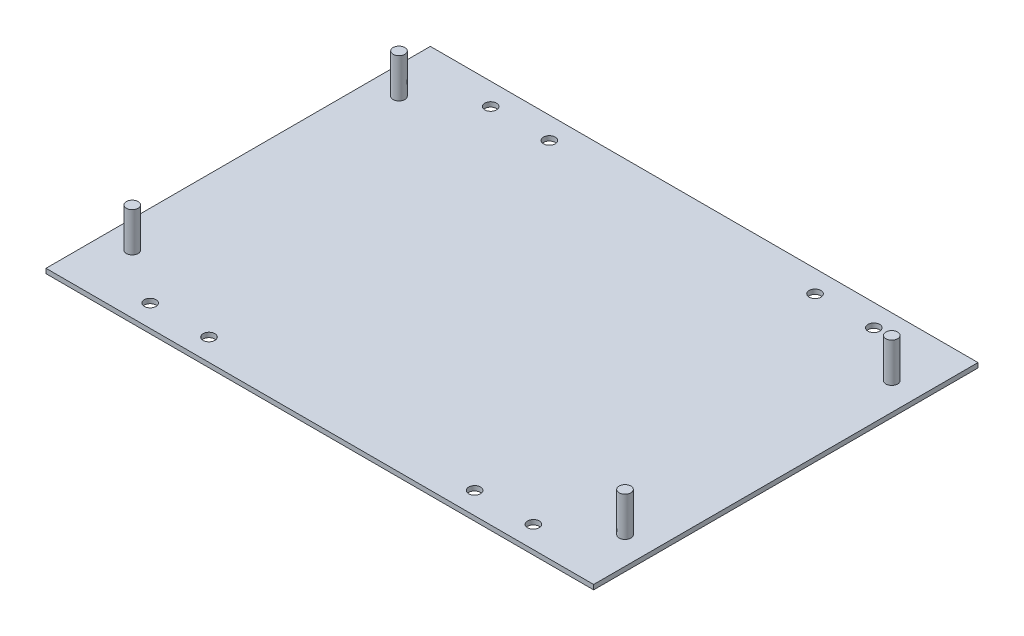
ISO-10303-21;
HEADER;
FILE_DESCRIPTION(('STEP AP214'),'2;1');
FILE_NAME('part.step','',(''),(''),'','','');
FILE_SCHEMA(('AUTOMOTIVE_DESIGN { 1 0 10303 214 1 1 1 1 }'));
ENDSEC;
DATA;
#1=APPLICATION_CONTEXT('core data for automotive mechanical design processes');
#2=APPLICATION_PROTOCOL_DEFINITION('international standard','automotive_design',2000,#1);
#3=PRODUCT_CONTEXT('',#1,'mechanical');
#4=PRODUCT('Part','Part','',(#3));
#5=PRODUCT_RELATED_PRODUCT_CATEGORY('part','',(#4));
#6=PRODUCT_DEFINITION_FORMATION('','',#4);
#7=PRODUCT_DEFINITION_CONTEXT('part definition',#1,'design');
#8=PRODUCT_DEFINITION('design','',#6,#7);
#9=PRODUCT_DEFINITION_SHAPE('','',#8);
#10=(LENGTH_UNIT() NAMED_UNIT(*) SI_UNIT(.MILLI.,.METRE.));
#11=(NAMED_UNIT(*) PLANE_ANGLE_UNIT() SI_UNIT($,.RADIAN.));
#12=(NAMED_UNIT(*) SI_UNIT($,.STERADIAN.) SOLID_ANGLE_UNIT());
#13=UNCERTAINTY_MEASURE_WITH_UNIT(LENGTH_MEASURE(1.E-05),#10,'distance_accuracy_value','');
#14=(GEOMETRIC_REPRESENTATION_CONTEXT(3) GLOBAL_UNCERTAINTY_ASSIGNED_CONTEXT((#13)) GLOBAL_UNIT_ASSIGNED_CONTEXT((#10,
#11,#12)) REPRESENTATION_CONTEXT('',''));
#15=CARTESIAN_POINT('',(0.,0.,0.));
#16=DIRECTION('',(0.,0.,1.));
#17=DIRECTION('',(1.,0.,0.));
#18=AXIS2_PLACEMENT_3D('',#15,#16,#17);
#19=CARTESIAN_POINT('',(0.,1.2,0.));
#20=DIRECTION('',(0.,-1.,0.));
#21=DIRECTION('',(0.,0.,-1.));
#22=AXIS2_PLACEMENT_3D('',#19,#20,#21);
#23=PLANE('',#22);
#24=CARTESIAN_POINT('',(62.85,1.2,-37.324));
#25=DIRECTION('',(0.,-1.,0.));
#26=DIRECTION('',(0.,0.,-1.));
#27=AXIS2_PLACEMENT_3D('',#24,#25,#26);
#28=CIRCLE('',#27,1.5);
#29=CARTESIAN_POINT('',(62.85,1.2,-38.824));
#30=VERTEX_POINT('',#29);
#31=EDGE_CURVE('E11',#30,#30,#28,.F.);
#32=ORIENTED_EDGE('',*,*,#31,.F.);
#33=EDGE_LOOP('',(#32));
#34=FACE_BOUND('',#33,.T.);
#35=CARTESIAN_POINT('',(62.85,1.2,30.72));
#36=DIRECTION('',(0.,-1.,0.));
#37=DIRECTION('',(0.,0.,-1.));
#38=AXIS2_PLACEMENT_3D('',#35,#36,#37);
#39=CIRCLE('',#38,1.5);
#40=CARTESIAN_POINT('',(62.85,1.2,29.22));
#41=VERTEX_POINT('',#40);
#42=EDGE_CURVE('E49',#41,#41,#39,.F.);
#43=ORIENTED_EDGE('',*,*,#42,.F.);
#44=EDGE_LOOP('',(#43));
#45=FACE_BOUND('',#44,.T.);
#46=CARTESIAN_POINT('',(-62.85,1.2,30.72));
#47=DIRECTION('',(0.,-1.,0.));
#48=DIRECTION('',(0.,0.,-1.));
#49=AXIS2_PLACEMENT_3D('',#46,#47,#48);
#50=CIRCLE('',#49,1.5);
#51=CARTESIAN_POINT('',(-62.85,1.2,29.22));
#52=VERTEX_POINT('',#51);
#53=EDGE_CURVE('E133',#52,#52,#50,.F.);
#54=ORIENTED_EDGE('',*,*,#53,.F.);
#55=EDGE_LOOP('',(#54));
#56=FACE_BOUND('',#55,.T.);
#57=CARTESIAN_POINT('',(-62.85,1.2,-37.324));
#58=DIRECTION('',(0.,-1.,0.));
#59=DIRECTION('',(0.,0.,-1.));
#60=AXIS2_PLACEMENT_3D('',#57,#58,#59);
#61=CIRCLE('',#60,1.5);
#62=CARTESIAN_POINT('',(-62.85,1.2,-38.824));
#63=VERTEX_POINT('',#62);
#64=EDGE_CURVE('E129',#63,#63,#61,.F.);
#65=ORIENTED_EDGE('',*,*,#64,.F.);
#66=EDGE_LOOP('',(#65));
#67=FACE_BOUND('',#66,.T.);
#68=DIRECTION('',(0.,0.,-1.));
#69=VECTOR('',#68,1.);
#70=CARTESIAN_POINT('',(69.85,1.2,45.72));
#71=LINE('',#70,#69);
#72=CARTESIAN_POINT('',(69.85,1.2,45.72));
#73=VERTEX_POINT('',#72);
#74=CARTESIAN_POINT('',(69.85,1.2,-52.324));
#75=VERTEX_POINT('',#74);
#76=EDGE_CURVE('E93',#73,#75,#71,.T.);
#77=ORIENTED_EDGE('',*,*,#76,.T.);
#78=DIRECTION('',(-1.,0.,0.));
#79=VECTOR('',#78,1.);
#80=CARTESIAN_POINT('',(-69.85,1.2,-52.324));
#81=LINE('',#80,#79);
#82=CARTESIAN_POINT('',(-69.85,1.2,-52.324));
#83=VERTEX_POINT('',#82);
#84=EDGE_CURVE('E88',#75,#83,#81,.T.);
#85=ORIENTED_EDGE('',*,*,#84,.T.);
#86=DIRECTION('',(0.,0.,1.));
#87=VECTOR('',#86,1.);
#88=CARTESIAN_POINT('',(-69.85,1.2,45.72));
#89=LINE('',#88,#87);
#90=CARTESIAN_POINT('',(-69.85,1.2,45.72));
#91=VERTEX_POINT('',#90);
#92=EDGE_CURVE('E91',#83,#91,#89,.T.);
#93=ORIENTED_EDGE('',*,*,#92,.T.);
#94=DIRECTION('',(1.,0.,0.));
#95=VECTOR('',#94,1.);
#96=CARTESIAN_POINT('',(-69.85,1.2,45.72));
#97=LINE('',#96,#95);
#98=EDGE_CURVE('E57',#91,#73,#97,.T.);
#99=ORIENTED_EDGE('',*,*,#98,.T.);
#100=EDGE_LOOP('',(#77,#85,#93,#99));
#101=FACE_BOUND('',#100,.T.);
#102=CARTESIAN_POINT('',(-48.8772454,1.2,40.12));
#103=DIRECTION('',(0.,1.,0.));
#104=DIRECTION('',(0.,0.,1.));
#105=AXIS2_PLACEMENT_3D('',#102,#103,#104);
#106=CIRCLE('',#105,1.5);
#107=CARTESIAN_POINT('',(-48.8772454,1.2,41.62));
#108=VERTEX_POINT('',#107);
#109=EDGE_CURVE('E116',#108,#108,#106,.T.);
#110=ORIENTED_EDGE('',*,*,#109,.F.);
#111=EDGE_LOOP('',(#110));
#112=FACE_BOUND('',#111,.T.);
#113=CARTESIAN_POINT('',(-33.8772454,1.2,40.12));
#114=DIRECTION('',(0.,1.,0.));
#115=DIRECTION('',(0.,0.,1.));
#116=AXIS2_PLACEMENT_3D('',#113,#114,#115);
#117=CIRCLE('',#116,1.5);
#118=CARTESIAN_POINT('',(-33.8772454,1.2,41.62));
#119=VERTEX_POINT('',#118);
#120=EDGE_CURVE('E278',#119,#119,#117,.T.);
#121=ORIENTED_EDGE('',*,*,#120,.F.);
#122=EDGE_LOOP('',(#121));
#123=FACE_BOUND('',#122,.T.);
#124=CARTESIAN_POINT('',(-33.891248194,1.2,-46.724));
#125=DIRECTION('',(0.,1.,0.));
#126=DIRECTION('',(0.,0.,-1.));
#127=AXIS2_PLACEMENT_3D('',#124,#125,#126);
#128=CIRCLE('',#127,1.49999999999998);
#129=CARTESIAN_POINT('',(-33.891248194,1.2,-48.224));
#130=VERTEX_POINT('',#129);
#131=EDGE_CURVE('E271',#130,#130,#128,.T.);
#132=ORIENTED_EDGE('',*,*,#131,.F.);
#133=EDGE_LOOP('',(#132));
#134=FACE_BOUND('',#133,.T.);
#135=CARTESIAN_POINT('',(-48.877248194,1.2,-46.724));
#136=DIRECTION('',(0.,1.,0.));
#137=DIRECTION('',(0.,0.,-1.));
#138=AXIS2_PLACEMENT_3D('',#135,#136,#137);
#139=CIRCLE('',#138,1.5);
#140=CARTESIAN_POINT('',(-48.877248194,1.2,-48.224));
#141=VERTEX_POINT('',#140);
#142=EDGE_CURVE('E264',#141,#141,#139,.T.);
#143=ORIENTED_EDGE('',*,*,#142,.F.);
#144=EDGE_LOOP('',(#143));
#145=FACE_BOUND('',#144,.T.);
#146=CARTESIAN_POINT('',(33.878607802263,1.2,-46.724));
#147=DIRECTION('',(0.,1.,0.));
#148=DIRECTION('',(0.,0.,1.));
#149=AXIS2_PLACEMENT_3D('',#146,#147,#148);
#150=CIRCLE('',#149,1.49999999999998);
#151=CARTESIAN_POINT('',(33.878607802263,1.2,-45.224));
#152=VERTEX_POINT('',#151);
#153=EDGE_CURVE('E257',#152,#152,#150,.T.);
#154=ORIENTED_EDGE('',*,*,#153,.F.);
#155=EDGE_LOOP('',(#154));
#156=FACE_BOUND('',#155,.T.);
#157=CARTESIAN_POINT('',(48.8772454,1.2,-46.724));
#158=DIRECTION('',(0.,1.,0.));
#159=DIRECTION('',(0.,0.,1.));
#160=AXIS2_PLACEMENT_3D('',#157,#158,#159);
#161=CIRCLE('',#160,1.5);
#162=CARTESIAN_POINT('',(48.8772454,1.2,-45.224));
#163=VERTEX_POINT('',#162);
#164=EDGE_CURVE('E250',#163,#163,#161,.T.);
#165=ORIENTED_EDGE('',*,*,#164,.F.);
#166=EDGE_LOOP('',(#165));
#167=FACE_BOUND('',#166,.T.);
#168=CARTESIAN_POINT('',(33.8772454,1.2,40.12));
#169=DIRECTION('',(0.,1.,0.));
#170=DIRECTION('',(0.,0.,-1.));
#171=AXIS2_PLACEMENT_3D('',#168,#169,#170);
#172=CIRCLE('',#171,1.5);
#173=CARTESIAN_POINT('',(33.8772454,1.2,38.62));
#174=VERTEX_POINT('',#173);
#175=EDGE_CURVE('E243',#174,#174,#172,.T.);
#176=ORIENTED_EDGE('',*,*,#175,.F.);
#177=EDGE_LOOP('',(#176));
#178=FACE_BOUND('',#177,.T.);
#179=CARTESIAN_POINT('',(48.8772454,1.2,40.12));
#180=DIRECTION('',(0.,1.,0.));
#181=DIRECTION('',(0.,0.,-1.));
#182=AXIS2_PLACEMENT_3D('',#179,#180,#181);
#183=CIRCLE('',#182,1.5);
#184=CARTESIAN_POINT('',(48.8772454,1.2,38.62));
#185=VERTEX_POINT('',#184);
#186=EDGE_CURVE('E231',#185,#185,#183,.T.);
#187=ORIENTED_EDGE('',*,*,#186,.F.);
#188=EDGE_LOOP('',(#187));
#189=FACE_BOUND('',#188,.T.);
#190=ADVANCED_FACE('F39',(#34,#45,#56,#67,#101,#112,#123,#134,#145,#156,#167,#178,#189),#23,.F.);
#191=CARTESIAN_POINT('',(0.,0.,0.));
#192=DIRECTION('',(0.,-1.,0.));
#193=DIRECTION('',(0.,0.,-1.));
#194=AXIS2_PLACEMENT_3D('',#191,#192,#193);
#195=PLANE('',#194);
#196=CARTESIAN_POINT('',(33.8772454,0.,40.12));
#197=DIRECTION('',(0.,1.,0.));
#198=DIRECTION('',(0.,0.,-1.));
#199=AXIS2_PLACEMENT_3D('',#196,#197,#198);
#200=CIRCLE('',#199,1.5);
#201=CARTESIAN_POINT('',(33.8772454,0.,38.62));
#202=VERTEX_POINT('',#201);
#203=EDGE_CURVE('E237',#202,#202,#200,.T.);
#204=ORIENTED_EDGE('',*,*,#203,.T.);
#205=EDGE_LOOP('',(#204));
#206=FACE_BOUND('',#205,.T.);
#207=CARTESIAN_POINT('',(33.878607802263,0.,-46.724));
#208=DIRECTION('',(0.,1.,0.));
#209=DIRECTION('',(0.,0.,1.));
#210=AXIS2_PLACEMENT_3D('',#207,#208,#209);
#211=CIRCLE('',#210,1.49999999999998);
#212=CARTESIAN_POINT('',(33.878607802263,0.,-45.224));
#213=VERTEX_POINT('',#212);
#214=EDGE_CURVE('E254',#213,#213,#211,.T.);
#215=ORIENTED_EDGE('',*,*,#214,.T.);
#216=EDGE_LOOP('',(#215));
#217=FACE_BOUND('',#216,.T.);
#218=CARTESIAN_POINT('',(-33.891248194,0.,-46.724));
#219=DIRECTION('',(0.,1.,0.));
#220=DIRECTION('',(0.,0.,-1.));
#221=AXIS2_PLACEMENT_3D('',#218,#219,#220);
#222=CIRCLE('',#221,1.49999999999998);
#223=CARTESIAN_POINT('',(-33.891248194,0.,-48.224));
#224=VERTEX_POINT('',#223);
#225=EDGE_CURVE('E268',#224,#224,#222,.T.);
#226=ORIENTED_EDGE('',*,*,#225,.T.);
#227=EDGE_LOOP('',(#226));
#228=FACE_BOUND('',#227,.T.);
#229=CARTESIAN_POINT('',(-48.8772454,0.,40.12));
#230=DIRECTION('',(0.,1.,0.));
#231=DIRECTION('',(0.,0.,1.));
#232=AXIS2_PLACEMENT_3D('',#229,#230,#231);
#233=CIRCLE('',#232,1.5);
#234=CARTESIAN_POINT('',(-48.8772454,0.,41.62));
#235=VERTEX_POINT('',#234);
#236=EDGE_CURVE('E282',#235,#235,#233,.T.);
#237=ORIENTED_EDGE('',*,*,#236,.T.);
#238=EDGE_LOOP('',(#237));
#239=FACE_BOUND('',#238,.T.);
#240=DIRECTION('',(0.,0.,-1.));
#241=VECTOR('',#240,1.);
#242=CARTESIAN_POINT('',(69.85,0.,45.72));
#243=LINE('',#242,#241);
#244=CARTESIAN_POINT('',(69.85,0.,45.72));
#245=VERTEX_POINT('',#244);
#246=CARTESIAN_POINT('',(69.85,0.,-52.324));
#247=VERTEX_POINT('',#246);
#248=EDGE_CURVE('E112',#245,#247,#243,.T.);
#249=ORIENTED_EDGE('',*,*,#248,.F.);
#250=DIRECTION('',(1.,0.,0.));
#251=VECTOR('',#250,1.);
#252=CARTESIAN_POINT('',(-69.85,0.,45.72));
#253=LINE('',#252,#251);
#254=CARTESIAN_POINT('',(-69.85,0.,45.72));
#255=VERTEX_POINT('',#254);
#256=EDGE_CURVE('E80',#255,#245,#253,.T.);
#257=ORIENTED_EDGE('',*,*,#256,.F.);
#258=DIRECTION('',(0.,0.,1.));
#259=VECTOR('',#258,1.);
#260=CARTESIAN_POINT('',(-69.85,0.,45.72));
#261=LINE('',#260,#259);
#262=CARTESIAN_POINT('',(-69.85,0.,-52.324));
#263=VERTEX_POINT('',#262);
#264=EDGE_CURVE('E74',#263,#255,#261,.T.);
#265=ORIENTED_EDGE('',*,*,#264,.F.);
#266=DIRECTION('',(-1.,0.,0.));
#267=VECTOR('',#266,1.);
#268=CARTESIAN_POINT('',(-69.85,0.,-52.324));
#269=LINE('',#268,#267);
#270=EDGE_CURVE('E99',#247,#263,#269,.T.);
#271=ORIENTED_EDGE('',*,*,#270,.F.);
#272=EDGE_LOOP('',(#249,#257,#265,#271));
#273=FACE_BOUND('',#272,.T.);
#274=CARTESIAN_POINT('',(-33.8772454,0.,40.12));
#275=DIRECTION('',(0.,1.,0.));
#276=DIRECTION('',(0.,0.,1.));
#277=AXIS2_PLACEMENT_3D('',#274,#275,#276);
#278=CIRCLE('',#277,1.5);
#279=CARTESIAN_POINT('',(-33.8772454,0.,41.62));
#280=VERTEX_POINT('',#279);
#281=EDGE_CURVE('E217',#280,#280,#278,.T.);
#282=ORIENTED_EDGE('',*,*,#281,.T.);
#283=EDGE_LOOP('',(#282));
#284=FACE_BOUND('',#283,.T.);
#285=CARTESIAN_POINT('',(-48.877248194,0.,-46.724));
#286=DIRECTION('',(0.,1.,0.));
#287=DIRECTION('',(0.,0.,-1.));
#288=AXIS2_PLACEMENT_3D('',#285,#286,#287);
#289=CIRCLE('',#288,1.5);
#290=CARTESIAN_POINT('',(-48.877248194,0.,-48.224));
#291=VERTEX_POINT('',#290);
#292=EDGE_CURVE('E221',#291,#291,#289,.T.);
#293=ORIENTED_EDGE('',*,*,#292,.T.);
#294=EDGE_LOOP('',(#293));
#295=FACE_BOUND('',#294,.T.);
#296=CARTESIAN_POINT('',(48.8772454,0.,-46.724));
#297=DIRECTION('',(0.,1.,0.));
#298=DIRECTION('',(0.,0.,1.));
#299=AXIS2_PLACEMENT_3D('',#296,#297,#298);
#300=CIRCLE('',#299,1.5);
#301=CARTESIAN_POINT('',(48.8772454,0.,-45.224));
#302=VERTEX_POINT('',#301);
#303=EDGE_CURVE('E225',#302,#302,#300,.T.);
#304=ORIENTED_EDGE('',*,*,#303,.T.);
#305=EDGE_LOOP('',(#304));
#306=FACE_BOUND('',#305,.T.);
#307=CARTESIAN_POINT('',(48.8772454,0.,40.12));
#308=DIRECTION('',(0.,1.,0.));
#309=DIRECTION('',(0.,0.,-1.));
#310=AXIS2_PLACEMENT_3D('',#307,#308,#309);
#311=CIRCLE('',#310,1.5);
#312=CARTESIAN_POINT('',(48.8772454,0.,38.62));
#313=VERTEX_POINT('',#312);
#314=EDGE_CURVE('E228',#313,#313,#311,.T.);
#315=ORIENTED_EDGE('',*,*,#314,.T.);
#316=EDGE_LOOP('',(#315));
#317=FACE_BOUND('',#316,.T.);
#318=ADVANCED_FACE('F144',(#206,#217,#228,#239,#273,#284,#295,#306,#317),#195,.T.);
#319=CARTESIAN_POINT('',(69.85,1.2,45.72));
#320=DIRECTION('',(-1.,0.,0.));
#321=DIRECTION('',(0.,0.,1.));
#322=AXIS2_PLACEMENT_3D('',#319,#320,#321);
#323=PLANE('',#322);
#324=ORIENTED_EDGE('',*,*,#248,.T.);
#325=DIRECTION('',(0.,-1.,0.));
#326=VECTOR('',#325,1.);
#327=CARTESIAN_POINT('',(69.85,1.2,-52.324));
#328=LINE('',#327,#326);
#329=EDGE_CURVE('E101',#75,#247,#328,.T.);
#330=ORIENTED_EDGE('',*,*,#329,.F.);
#331=ORIENTED_EDGE('',*,*,#76,.F.);
#332=DIRECTION('',(0.,-1.,0.));
#333=VECTOR('',#332,1.);
#334=CARTESIAN_POINT('',(69.85,1.2,45.72));
#335=LINE('',#334,#333);
#336=EDGE_CURVE('E108',#73,#245,#335,.T.);
#337=ORIENTED_EDGE('',*,*,#336,.T.);
#338=EDGE_LOOP('',(#324,#330,#331,#337));
#339=FACE_BOUND('',#338,.T.);
#340=ADVANCED_FACE('F41',(#339),#323,.F.);
#341=CARTESIAN_POINT('',(-69.85,1.2,-52.324));
#342=DIRECTION('',(0.,0.,1.));
#343=DIRECTION('',(1.,0.,0.));
#344=AXIS2_PLACEMENT_3D('',#341,#342,#343);
#345=PLANE('',#344);
#346=ORIENTED_EDGE('',*,*,#270,.T.);
#347=DIRECTION('',(0.,-1.,0.));
#348=VECTOR('',#347,1.);
#349=CARTESIAN_POINT('',(-69.85,1.2,-52.324));
#350=LINE('',#349,#348);
#351=EDGE_CURVE('E97',#83,#263,#350,.T.);
#352=ORIENTED_EDGE('',*,*,#351,.F.);
#353=ORIENTED_EDGE('',*,*,#84,.F.);
#354=ORIENTED_EDGE('',*,*,#329,.T.);
#355=EDGE_LOOP('',(#346,#352,#353,#354));
#356=FACE_BOUND('',#355,.T.);
#357=ADVANCED_FACE('F98',(#356),#345,.F.);
#358=CARTESIAN_POINT('',(-69.85,1.2,45.72));
#359=DIRECTION('',(1.,0.,0.));
#360=DIRECTION('',(0.,0.,-1.));
#361=AXIS2_PLACEMENT_3D('',#358,#359,#360);
#362=PLANE('',#361);
#363=ORIENTED_EDGE('',*,*,#264,.T.);
#364=DIRECTION('',(0.,-1.,0.));
#365=VECTOR('',#364,1.);
#366=CARTESIAN_POINT('',(-69.85,1.2,45.72));
#367=LINE('',#366,#365);
#368=EDGE_CURVE('E102',#91,#255,#367,.T.);
#369=ORIENTED_EDGE('',*,*,#368,.F.);
#370=ORIENTED_EDGE('',*,*,#92,.F.);
#371=ORIENTED_EDGE('',*,*,#351,.T.);
#372=EDGE_LOOP('',(#363,#369,#370,#371));
#373=FACE_BOUND('',#372,.T.);
#374=ADVANCED_FACE('F104',(#373),#362,.F.);
#375=CARTESIAN_POINT('',(-69.85,1.2,45.72));
#376=DIRECTION('',(0.,0.,-1.));
#377=DIRECTION('',(-1.,0.,0.));
#378=AXIS2_PLACEMENT_3D('',#375,#376,#377);
#379=PLANE('',#378);
#380=ORIENTED_EDGE('',*,*,#256,.T.);
#381=ORIENTED_EDGE('',*,*,#336,.F.);
#382=ORIENTED_EDGE('',*,*,#98,.F.);
#383=ORIENTED_EDGE('',*,*,#368,.T.);
#384=EDGE_LOOP('',(#380,#381,#382,#383));
#385=FACE_BOUND('',#384,.T.);
#386=ADVANCED_FACE('F195',(#385),#379,.F.);
#387=CARTESIAN_POINT('',(-48.8772454,1.2,40.12));
#388=DIRECTION('',(0.,-1.,0.));
#389=DIRECTION('',(0.,0.,-1.));
#390=AXIS2_PLACEMENT_3D('',#387,#388,#389);
#391=CYLINDRICAL_SURFACE('',#390,1.5);
#392=ORIENTED_EDGE('',*,*,#109,.T.);
#393=EDGE_LOOP('',(#392));
#394=FACE_BOUND('',#393,.T.);
#395=ORIENTED_EDGE('',*,*,#236,.F.);
#396=EDGE_LOOP('',(#395));
#397=FACE_BOUND('',#396,.T.);
#398=ADVANCED_FACE('F192',(#394,#397),#391,.F.);
#399=CARTESIAN_POINT('',(-33.8772454,1.2,40.12));
#400=DIRECTION('',(0.,-1.,0.));
#401=DIRECTION('',(0.,0.,-1.));
#402=AXIS2_PLACEMENT_3D('',#399,#400,#401);
#403=CYLINDRICAL_SURFACE('',#402,1.5);
#404=ORIENTED_EDGE('',*,*,#120,.T.);
#405=EDGE_LOOP('',(#404));
#406=FACE_BOUND('',#405,.T.);
#407=ORIENTED_EDGE('',*,*,#281,.F.);
#408=EDGE_LOOP('',(#407));
#409=FACE_BOUND('',#408,.T.);
#410=ADVANCED_FACE('F188',(#406,#409),#403,.F.);
#411=CARTESIAN_POINT('',(-33.891248194,1.2,-46.724));
#412=DIRECTION('',(0.,-1.,0.));
#413=DIRECTION('',(0.,0.,-1.));
#414=AXIS2_PLACEMENT_3D('',#411,#412,#413);
#415=CYLINDRICAL_SURFACE('',#414,1.49999999999998);
#416=ORIENTED_EDGE('',*,*,#131,.T.);
#417=EDGE_LOOP('',(#416));
#418=FACE_BOUND('',#417,.T.);
#419=ORIENTED_EDGE('',*,*,#225,.F.);
#420=EDGE_LOOP('',(#419));
#421=FACE_BOUND('',#420,.T.);
#422=ADVANCED_FACE('F184',(#418,#421),#415,.F.);
#423=CARTESIAN_POINT('',(-48.877248194,1.2,-46.724));
#424=DIRECTION('',(0.,-1.,0.));
#425=DIRECTION('',(0.,0.,-1.));
#426=AXIS2_PLACEMENT_3D('',#423,#424,#425);
#427=CYLINDRICAL_SURFACE('',#426,1.5);
#428=ORIENTED_EDGE('',*,*,#142,.T.);
#429=EDGE_LOOP('',(#428));
#430=FACE_BOUND('',#429,.T.);
#431=ORIENTED_EDGE('',*,*,#292,.F.);
#432=EDGE_LOOP('',(#431));
#433=FACE_BOUND('',#432,.T.);
#434=ADVANCED_FACE('F180',(#430,#433),#427,.F.);
#435=CARTESIAN_POINT('',(33.878607802263,1.2,-46.724));
#436=DIRECTION('',(0.,-1.,0.));
#437=DIRECTION('',(0.,0.,-1.));
#438=AXIS2_PLACEMENT_3D('',#435,#436,#437);
#439=CYLINDRICAL_SURFACE('',#438,1.49999999999998);
#440=ORIENTED_EDGE('',*,*,#153,.T.);
#441=EDGE_LOOP('',(#440));
#442=FACE_BOUND('',#441,.T.);
#443=ORIENTED_EDGE('',*,*,#214,.F.);
#444=EDGE_LOOP('',(#443));
#445=FACE_BOUND('',#444,.T.);
#446=ADVANCED_FACE('F176',(#442,#445),#439,.F.);
#447=CARTESIAN_POINT('',(48.8772454,1.2,-46.724));
#448=DIRECTION('',(0.,-1.,0.));
#449=DIRECTION('',(0.,0.,-1.));
#450=AXIS2_PLACEMENT_3D('',#447,#448,#449);
#451=CYLINDRICAL_SURFACE('',#450,1.5);
#452=ORIENTED_EDGE('',*,*,#164,.T.);
#453=EDGE_LOOP('',(#452));
#454=FACE_BOUND('',#453,.T.);
#455=ORIENTED_EDGE('',*,*,#303,.F.);
#456=EDGE_LOOP('',(#455));
#457=FACE_BOUND('',#456,.T.);
#458=ADVANCED_FACE('F172',(#454,#457),#451,.F.);
#459=CARTESIAN_POINT('',(33.8772454,1.2,40.12));
#460=DIRECTION('',(0.,-1.,0.));
#461=DIRECTION('',(0.,0.,-1.));
#462=AXIS2_PLACEMENT_3D('',#459,#460,#461);
#463=CYLINDRICAL_SURFACE('',#462,1.5);
#464=ORIENTED_EDGE('',*,*,#175,.T.);
#465=EDGE_LOOP('',(#464));
#466=FACE_BOUND('',#465,.T.);
#467=ORIENTED_EDGE('',*,*,#203,.F.);
#468=EDGE_LOOP('',(#467));
#469=FACE_BOUND('',#468,.T.);
#470=ADVANCED_FACE('F164',(#466,#469),#463,.F.);
#471=CARTESIAN_POINT('',(48.8772454,1.2,40.12));
#472=DIRECTION('',(0.,-1.,0.));
#473=DIRECTION('',(0.,0.,-1.));
#474=AXIS2_PLACEMENT_3D('',#471,#472,#473);
#475=CYLINDRICAL_SURFACE('',#474,1.5);
#476=ORIENTED_EDGE('',*,*,#186,.T.);
#477=EDGE_LOOP('',(#476));
#478=FACE_BOUND('',#477,.T.);
#479=ORIENTED_EDGE('',*,*,#314,.F.);
#480=EDGE_LOOP('',(#479));
#481=FACE_BOUND('',#480,.T.);
#482=ADVANCED_FACE('F154',(#478,#481),#475,.F.);
#483=CARTESIAN_POINT('',(-62.85,11.2,-37.324));
#484=DIRECTION('',(0.,-1.,0.));
#485=DIRECTION('',(0.,0.,-1.));
#486=AXIS2_PLACEMENT_3D('',#483,#484,#485);
#487=CYLINDRICAL_SURFACE('',#486,1.5);
#488=CARTESIAN_POINT('',(-62.85,11.2,-37.324));
#489=DIRECTION('',(0.,1.,0.));
#490=DIRECTION('',(0.,0.,1.));
#491=AXIS2_PLACEMENT_3D('',#488,#489,#490);
#492=CIRCLE('',#491,1.5);
#493=CARTESIAN_POINT('',(-62.85,11.2,-35.824));
#494=VERTEX_POINT('',#493);
#495=EDGE_CURVE('E232',#494,#494,#492,.T.);
#496=ORIENTED_EDGE('',*,*,#495,.F.);
#497=EDGE_LOOP('',(#496));
#498=FACE_BOUND('',#497,.T.);
#499=ORIENTED_EDGE('',*,*,#64,.T.);
#500=EDGE_LOOP('',(#499));
#501=FACE_BOUND('',#500,.T.);
#502=ADVANCED_FACE('F151',(#498,#501),#487,.T.);
#503=CARTESIAN_POINT('',(-62.85,11.2,-37.324));
#504=DIRECTION('',(0.,1.,0.));
#505=DIRECTION('',(0.,0.,1.));
#506=AXIS2_PLACEMENT_3D('',#503,#504,#505);
#507=PLANE('',#506);
#508=ORIENTED_EDGE('',*,*,#495,.T.);
#509=EDGE_LOOP('',(#508));
#510=FACE_BOUND('',#509,.T.);
#511=ADVANCED_FACE('F153',(#510),#507,.T.);
#512=CARTESIAN_POINT('',(-62.85,11.2,30.72));
#513=DIRECTION('',(0.,-1.,0.));
#514=DIRECTION('',(0.,0.,-1.));
#515=AXIS2_PLACEMENT_3D('',#512,#513,#514);
#516=CYLINDRICAL_SURFACE('',#515,1.5);
#517=CARTESIAN_POINT('',(-62.85,11.2,30.72));
#518=DIRECTION('',(0.,1.,0.));
#519=DIRECTION('',(0.,0.,-1.));
#520=AXIS2_PLACEMENT_3D('',#517,#518,#519);
#521=CIRCLE('',#520,1.5);
#522=CARTESIAN_POINT('',(-62.85,11.2,29.22));
#523=VERTEX_POINT('',#522);
#524=EDGE_CURVE('E240',#523,#523,#521,.T.);
#525=ORIENTED_EDGE('',*,*,#524,.F.);
#526=EDGE_LOOP('',(#525));
#527=FACE_BOUND('',#526,.T.);
#528=ORIENTED_EDGE('',*,*,#53,.T.);
#529=EDGE_LOOP('',(#528));
#530=FACE_BOUND('',#529,.T.);
#531=ADVANCED_FACE('F161',(#527,#530),#516,.T.);
#532=CARTESIAN_POINT('',(-62.85,11.2,30.72));
#533=DIRECTION('',(0.,-1.,0.));
#534=DIRECTION('',(0.,0.,-1.));
#535=AXIS2_PLACEMENT_3D('',#532,#533,#534);
#536=PLANE('',#535);
#537=ORIENTED_EDGE('',*,*,#524,.T.);
#538=EDGE_LOOP('',(#537));
#539=FACE_BOUND('',#538,.T.);
#540=ADVANCED_FACE('F351',(#539),#536,.F.);
#541=CARTESIAN_POINT('',(62.85,11.2,30.72));
#542=DIRECTION('',(0.,-1.,0.));
#543=DIRECTION('',(0.,0.,-1.));
#544=AXIS2_PLACEMENT_3D('',#541,#542,#543);
#545=CYLINDRICAL_SURFACE('',#544,1.5);
#546=CARTESIAN_POINT('',(62.85,11.2,30.72));
#547=DIRECTION('',(0.,1.,0.));
#548=DIRECTION('',(0.,0.,1.));
#549=AXIS2_PLACEMENT_3D('',#546,#547,#548);
#550=CIRCLE('',#549,1.5);
#551=CARTESIAN_POINT('',(62.85,11.2,32.22));
#552=VERTEX_POINT('',#551);
#553=EDGE_CURVE('E324',#552,#552,#550,.T.);
#554=ORIENTED_EDGE('',*,*,#553,.F.);
#555=EDGE_LOOP('',(#554));
#556=FACE_BOUND('',#555,.T.);
#557=ORIENTED_EDGE('',*,*,#42,.T.);
#558=EDGE_LOOP('',(#557));
#559=FACE_BOUND('',#558,.T.);
#560=ADVANCED_FACE('F140',(#556,#559),#545,.T.);
#561=CARTESIAN_POINT('',(62.85,11.2,30.72));
#562=DIRECTION('',(0.,1.,0.));
#563=DIRECTION('',(0.,0.,1.));
#564=AXIS2_PLACEMENT_3D('',#561,#562,#563);
#565=PLANE('',#564);
#566=ORIENTED_EDGE('',*,*,#553,.T.);
#567=EDGE_LOOP('',(#566));
#568=FACE_BOUND('',#567,.T.);
#569=ADVANCED_FACE('F338',(#568),#565,.T.);
#570=CARTESIAN_POINT('',(62.85,11.2,-37.324));
#571=DIRECTION('',(0.,-1.,0.));
#572=DIRECTION('',(0.,0.,-1.));
#573=AXIS2_PLACEMENT_3D('',#570,#571,#572);
#574=CYLINDRICAL_SURFACE('',#573,1.5);
#575=CARTESIAN_POINT('',(62.85,11.2,-37.324));
#576=DIRECTION('',(0.,1.,0.));
#577=DIRECTION('',(0.,0.,-1.));
#578=AXIS2_PLACEMENT_3D('',#575,#576,#577);
#579=CIRCLE('',#578,1.5);
#580=CARTESIAN_POINT('',(62.85,11.2,-38.824));
#581=VERTEX_POINT('',#580);
#582=EDGE_CURVE('E328',#581,#581,#579,.T.);
#583=ORIENTED_EDGE('',*,*,#582,.F.);
#584=EDGE_LOOP('',(#583));
#585=FACE_BOUND('',#584,.T.);
#586=ORIENTED_EDGE('',*,*,#31,.T.);
#587=EDGE_LOOP('',(#586));
#588=FACE_BOUND('',#587,.T.);
#589=ADVANCED_FACE('F335',(#585,#588),#574,.T.);
#590=CARTESIAN_POINT('',(62.85,11.2,-37.324));
#591=DIRECTION('',(0.,-1.,0.));
#592=DIRECTION('',(0.,0.,-1.));
#593=AXIS2_PLACEMENT_3D('',#590,#591,#592);
#594=PLANE('',#593);
#595=ORIENTED_EDGE('',*,*,#582,.T.);
#596=EDGE_LOOP('',(#595));
#597=FACE_BOUND('',#596,.T.);
#598=ADVANCED_FACE('F333',(#597),#594,.F.);
#599=CLOSED_SHELL('',(#190,#318,#340,#357,#374,#386,#398,#410,#422,#434,#446,#458,#470,#482,
#502,#511,#531,#540,#560,#569,#589,#598));
#600=MANIFOLD_SOLID_BREP('B2',#599);
#601=ADVANCED_BREP_SHAPE_REPRESENTATION('',(#18,#600),#14);
#602=SHAPE_DEFINITION_REPRESENTATION(#9,#601);
ENDSEC;
END-ISO-10303-21;
